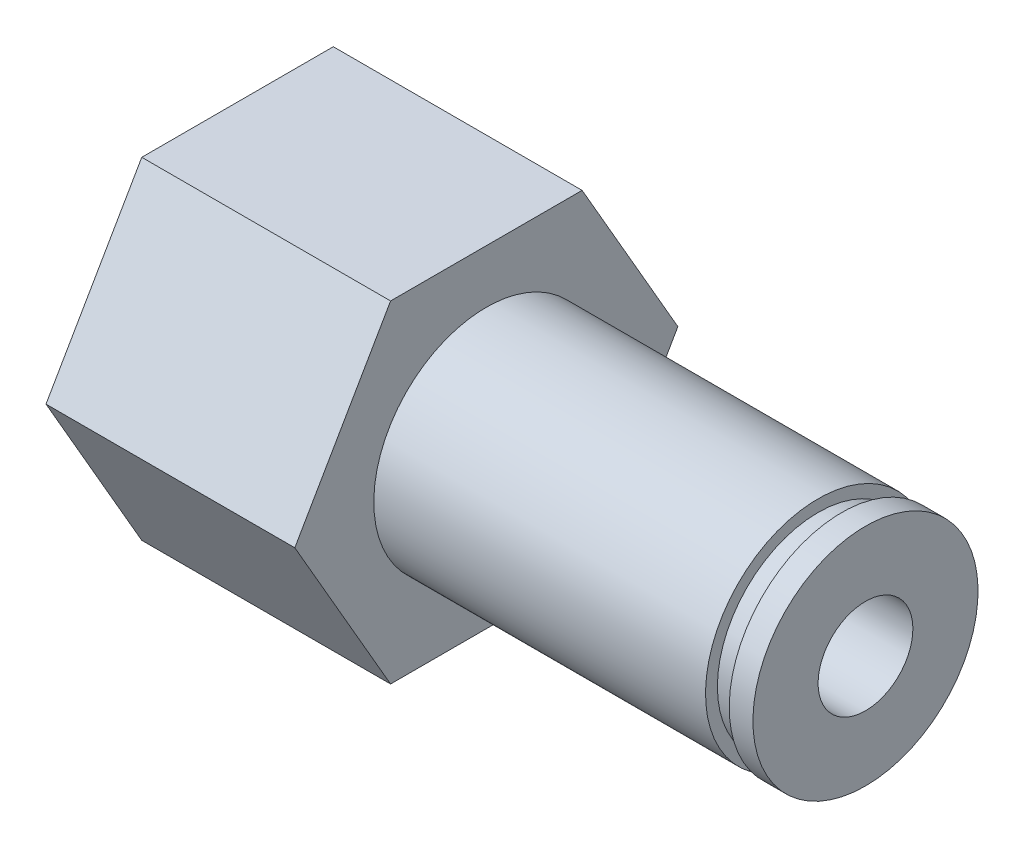
ISO-10303-21;
HEADER;
FILE_DESCRIPTION(('STEP AP214'),'2;1');
FILE_NAME('part.step','',(''),(''),'','','');
FILE_SCHEMA(('AUTOMOTIVE_DESIGN { 1 0 10303 214 1 1 1 1 }'));
ENDSEC;
DATA;
#1=APPLICATION_CONTEXT('core data for automotive mechanical design processes');
#2=APPLICATION_PROTOCOL_DEFINITION('international standard','automotive_design',2000,#1);
#3=PRODUCT_CONTEXT('',#1,'mechanical');
#4=PRODUCT('Part','Part','',(#3));
#5=PRODUCT_RELATED_PRODUCT_CATEGORY('part','',(#4));
#6=PRODUCT_DEFINITION_FORMATION('','',#4);
#7=PRODUCT_DEFINITION_CONTEXT('part definition',#1,'design');
#8=PRODUCT_DEFINITION('design','',#6,#7);
#9=PRODUCT_DEFINITION_SHAPE('','',#8);
#10=(LENGTH_UNIT() NAMED_UNIT(*) SI_UNIT(.MILLI.,.METRE.));
#11=(NAMED_UNIT(*) PLANE_ANGLE_UNIT() SI_UNIT($,.RADIAN.));
#12=(NAMED_UNIT(*) SI_UNIT($,.STERADIAN.) SOLID_ANGLE_UNIT());
#13=UNCERTAINTY_MEASURE_WITH_UNIT(LENGTH_MEASURE(1.E-05),#10,'distance_accuracy_value','');
#14=(GEOMETRIC_REPRESENTATION_CONTEXT(3) GLOBAL_UNCERTAINTY_ASSIGNED_CONTEXT((#13)) GLOBAL_UNIT_ASSIGNED_CONTEXT((#10,
#11,#12)) REPRESENTATION_CONTEXT('',''));
#15=CARTESIAN_POINT('',(0.,0.,0.));
#16=DIRECTION('',(0.,0.,1.));
#17=DIRECTION('',(1.,0.,0.));
#18=AXIS2_PLACEMENT_3D('',#15,#16,#17);
#19=CARTESIAN_POINT('',(0.,4.86,0.));
#20=DIRECTION('',(1.,0.,0.));
#21=DIRECTION('',(0.,1.,0.));
#22=AXIS2_PLACEMENT_3D('',#19,#20,#21);
#23=PLANE('',#22);
#24=DIRECTION('',(0.,0.866025403784439,-0.5));
#25=VECTOR('',#24,1.);
#26=CARTESIAN_POINT('',(0.,-7.,-4.04145188432738));
#27=LINE('',#26,#25);
#28=CARTESIAN_POINT('',(0.,-7.,-4.04145188432738));
#29=VERTEX_POINT('',#28);
#30=CARTESIAN_POINT('',(0.,0.,-8.08290376865476));
#31=VERTEX_POINT('',#30);
#32=EDGE_CURVE('E196',#29,#31,#27,.T.);
#33=ORIENTED_EDGE('',*,*,#32,.F.);
#34=DIRECTION('',(0.,0.,-1.));
#35=VECTOR('',#34,1.);
#36=CARTESIAN_POINT('',(0.,-7.,4.04145188432738));
#37=LINE('',#36,#35);
#38=CARTESIAN_POINT('',(0.,-7.,4.04145188432738));
#39=VERTEX_POINT('',#38);
#40=EDGE_CURVE('E198',#39,#29,#37,.T.);
#41=ORIENTED_EDGE('',*,*,#40,.F.);
#42=DIRECTION('',(0.,-0.866025403784439,-0.5));
#43=VECTOR('',#42,1.);
#44=CARTESIAN_POINT('',(0.,0.,8.08290376865476));
#45=LINE('',#44,#43);
#46=CARTESIAN_POINT('',(0.,0.,8.08290376865476));
#47=VERTEX_POINT('',#46);
#48=EDGE_CURVE('E213',#47,#39,#45,.T.);
#49=ORIENTED_EDGE('',*,*,#48,.F.);
#50=DIRECTION('',(0.,-0.866025403784439,0.5));
#51=VECTOR('',#50,1.);
#52=CARTESIAN_POINT('',(0.,7.,4.04145188432738));
#53=LINE('',#52,#51);
#54=CARTESIAN_POINT('',(0.,7.,4.04145188432738));
#55=VERTEX_POINT('',#54);
#56=EDGE_CURVE('E29',#55,#47,#53,.T.);
#57=ORIENTED_EDGE('',*,*,#56,.F.);
#58=DIRECTION('',(0.,0.,1.));
#59=VECTOR('',#58,1.);
#60=CARTESIAN_POINT('',(0.,7.,-4.04145188432738));
#61=LINE('',#60,#59);
#62=CARTESIAN_POINT('',(0.,7.,-4.04145188432738));
#63=VERTEX_POINT('',#62);
#64=EDGE_CURVE('E205',#63,#55,#61,.T.);
#65=ORIENTED_EDGE('',*,*,#64,.F.);
#66=DIRECTION('',(0.,0.866025403784439,0.5));
#67=VECTOR('',#66,1.);
#68=CARTESIAN_POINT('',(0.,0.,-8.08290376865476));
#69=LINE('',#68,#67);
#70=EDGE_CURVE('E201',#31,#63,#69,.T.);
#71=ORIENTED_EDGE('',*,*,#70,.F.);
#72=EDGE_LOOP('',(#33,#41,#49,#57,#65,#71));
#73=FACE_BOUND('',#72,.T.);
#74=CARTESIAN_POINT('',(0.,0.,0.));
#75=DIRECTION('',(-1.,0.,0.));
#76=DIRECTION('',(0.,-1.,0.));
#77=AXIS2_PLACEMENT_3D('',#74,#75,#76);
#78=CIRCLE('',#77,4.86);
#79=CARTESIAN_POINT('',(0.,-4.86,0.));
#80=VERTEX_POINT('',#79);
#81=EDGE_CURVE('E90',#80,#80,#78,.T.);
#82=ORIENTED_EDGE('',*,*,#81,.F.);
#83=EDGE_LOOP('',(#82));
#84=FACE_BOUND('',#83,.T.);
#85=ADVANCED_FACE('F15',(#73,#84),#23,.F.);
#86=CARTESIAN_POINT('',(10.5,9.,0.));
#87=DIRECTION('',(-1.,0.,0.));
#88=DIRECTION('',(0.,-1.,0.));
#89=AXIS2_PLACEMENT_3D('',#86,#87,#88);
#90=PLANE('',#89);
#91=DIRECTION('',(0.,0.866025403784439,0.5));
#92=VECTOR('',#91,1.);
#93=CARTESIAN_POINT('',(10.5,0.,8.08290376865476));
#94=LINE('',#93,#92);
#95=CARTESIAN_POINT('',(10.5,-7.,4.04145188432738));
#96=VERTEX_POINT('',#95);
#97=CARTESIAN_POINT('',(10.5,0.,8.08290376865476));
#98=VERTEX_POINT('',#97);
#99=EDGE_CURVE('E66',#96,#98,#94,.T.);
#100=ORIENTED_EDGE('',*,*,#99,.F.);
#101=DIRECTION('',(0.,0.,1.));
#102=VECTOR('',#101,1.);
#103=CARTESIAN_POINT('',(10.5,-7.,4.04145188432738));
#104=LINE('',#103,#102);
#105=CARTESIAN_POINT('',(10.5,-7.,-4.04145188432738));
#106=VERTEX_POINT('',#105);
#107=EDGE_CURVE('E74',#106,#96,#104,.T.);
#108=ORIENTED_EDGE('',*,*,#107,.F.);
#109=DIRECTION('',(0.,-0.866025403784439,0.5));
#110=VECTOR('',#109,1.);
#111=CARTESIAN_POINT('',(10.5,-7.,-4.04145188432738));
#112=LINE('',#111,#110);
#113=CARTESIAN_POINT('',(10.5,0.,-8.08290376865476));
#114=VERTEX_POINT('',#113);
#115=EDGE_CURVE('E94',#114,#106,#112,.T.);
#116=ORIENTED_EDGE('',*,*,#115,.F.);
#117=DIRECTION('',(0.,-0.866025403784439,-0.5));
#118=VECTOR('',#117,1.);
#119=CARTESIAN_POINT('',(10.5,0.,-8.08290376865476));
#120=LINE('',#119,#118);
#121=CARTESIAN_POINT('',(10.5,7.,-4.04145188432738));
#122=VERTEX_POINT('',#121);
#123=EDGE_CURVE('E86',#122,#114,#120,.T.);
#124=ORIENTED_EDGE('',*,*,#123,.F.);
#125=DIRECTION('',(0.,0.,-1.));
#126=VECTOR('',#125,1.);
#127=CARTESIAN_POINT('',(10.5,7.,-4.04145188432738));
#128=LINE('',#127,#126);
#129=CARTESIAN_POINT('',(10.5,7.,4.04145188432738));
#130=VERTEX_POINT('',#129);
#131=EDGE_CURVE('E84',#130,#122,#128,.T.);
#132=ORIENTED_EDGE('',*,*,#131,.F.);
#133=DIRECTION('',(0.,0.866025403784439,-0.5));
#134=VECTOR('',#133,1.);
#135=CARTESIAN_POINT('',(10.5,7.,4.04145188432738));
#136=LINE('',#135,#134);
#137=EDGE_CURVE('E73',#98,#130,#136,.T.);
#138=ORIENTED_EDGE('',*,*,#137,.F.);
#139=EDGE_LOOP('',(#100,#108,#116,#124,#132,#138));
#140=FACE_BOUND('',#139,.T.);
#141=CARTESIAN_POINT('',(10.5,0.,0.));
#142=DIRECTION('',(-1.,0.,0.));
#143=DIRECTION('',(0.,-1.,0.));
#144=AXIS2_PLACEMENT_3D('',#141,#142,#143);
#145=CIRCLE('',#144,4.75);
#146=CARTESIAN_POINT('',(10.5,-4.75,0.));
#147=VERTEX_POINT('',#146);
#148=EDGE_CURVE('E9',#147,#147,#145,.T.);
#149=ORIENTED_EDGE('',*,*,#148,.T.);
#150=EDGE_LOOP('',(#149));
#151=FACE_BOUND('',#150,.T.);
#152=ADVANCED_FACE('F81',(#140,#151),#90,.F.);
#153=CARTESIAN_POINT('',(-53.5591054313099,0.,0.));
#154=DIRECTION('',(-1.,0.,0.));
#155=DIRECTION('',(0.,-1.,0.));
#156=AXIS2_PLACEMENT_3D('',#153,#154,#155);
#157=CYLINDRICAL_SURFACE('',#156,4.75);
#158=ORIENTED_EDGE('',*,*,#148,.F.);
#159=EDGE_LOOP('',(#158));
#160=FACE_BOUND('',#159,.T.);
#161=CARTESIAN_POINT('',(24.5,0.,0.));
#162=DIRECTION('',(-1.,0.,0.));
#163=DIRECTION('',(0.,-1.,0.));
#164=AXIS2_PLACEMENT_3D('',#161,#162,#163);
#165=CIRCLE('',#164,4.75);
#166=CARTESIAN_POINT('',(24.5,-4.75,0.));
#167=VERTEX_POINT('',#166);
#168=EDGE_CURVE('E22',#167,#167,#165,.T.);
#169=ORIENTED_EDGE('',*,*,#168,.T.);
#170=EDGE_LOOP('',(#169));
#171=FACE_BOUND('',#170,.T.);
#172=ADVANCED_FACE('F123',(#160,#171),#157,.T.);
#173=CARTESIAN_POINT('',(24.5,4.75,0.));
#174=DIRECTION('',(-1.,0.,0.));
#175=DIRECTION('',(0.,-1.,0.));
#176=AXIS2_PLACEMENT_3D('',#173,#174,#175);
#177=PLANE('',#176);
#178=ORIENTED_EDGE('',*,*,#168,.F.);
#179=EDGE_LOOP('',(#178));
#180=FACE_BOUND('',#179,.T.);
#181=CARTESIAN_POINT('',(24.5,0.,0.));
#182=DIRECTION('',(-1.,0.,0.));
#183=DIRECTION('',(0.,-1.,0.));
#184=AXIS2_PLACEMENT_3D('',#181,#182,#183);
#185=CIRCLE('',#184,4.25);
#186=CARTESIAN_POINT('',(24.5,-4.25,0.));
#187=VERTEX_POINT('',#186);
#188=EDGE_CURVE('E118',#187,#187,#185,.T.);
#189=ORIENTED_EDGE('',*,*,#188,.T.);
#190=EDGE_LOOP('',(#189));
#191=FACE_BOUND('',#190,.T.);
#192=ADVANCED_FACE('F125',(#180,#191),#177,.F.);
#193=CARTESIAN_POINT('',(-53.5591054313099,0.,0.));
#194=DIRECTION('',(-1.,0.,0.));
#195=DIRECTION('',(0.,-1.,0.));
#196=AXIS2_PLACEMENT_3D('',#193,#194,#195);
#197=CYLINDRICAL_SURFACE('',#196,4.25);
#198=ORIENTED_EDGE('',*,*,#188,.F.);
#199=EDGE_LOOP('',(#198));
#200=FACE_BOUND('',#199,.T.);
#201=CARTESIAN_POINT('',(25.5,0.,0.));
#202=DIRECTION('',(-1.,0.,0.));
#203=DIRECTION('',(0.,-1.,0.));
#204=AXIS2_PLACEMENT_3D('',#201,#202,#203);
#205=CIRCLE('',#204,4.25);
#206=CARTESIAN_POINT('',(25.5,-4.25,0.));
#207=VERTEX_POINT('',#206);
#208=EDGE_CURVE('E115',#207,#207,#205,.T.);
#209=ORIENTED_EDGE('',*,*,#208,.T.);
#210=EDGE_LOOP('',(#209));
#211=FACE_BOUND('',#210,.T.);
#212=ADVANCED_FACE('F128',(#200,#211),#197,.T.);
#213=CARTESIAN_POINT('',(25.5,4.25,0.));
#214=DIRECTION('',(1.,0.,0.));
#215=DIRECTION('',(0.,1.,0.));
#216=AXIS2_PLACEMENT_3D('',#213,#214,#215);
#217=PLANE('',#216);
#218=ORIENTED_EDGE('',*,*,#208,.F.);
#219=EDGE_LOOP('',(#218));
#220=FACE_BOUND('',#219,.T.);
#221=CARTESIAN_POINT('',(25.5,0.,0.));
#222=DIRECTION('',(-1.,0.,0.));
#223=DIRECTION('',(0.,-1.,0.));
#224=AXIS2_PLACEMENT_3D('',#221,#222,#223);
#225=CIRCLE('',#224,4.74999999999999);
#226=CARTESIAN_POINT('',(25.5,-4.74999999999999,0.));
#227=VERTEX_POINT('',#226);
#228=EDGE_CURVE('E112',#227,#227,#225,.T.);
#229=ORIENTED_EDGE('',*,*,#228,.T.);
#230=EDGE_LOOP('',(#229));
#231=FACE_BOUND('',#230,.T.);
#232=ADVANCED_FACE('F134',(#220,#231),#217,.F.);
#233=CARTESIAN_POINT('',(-53.5591054313099,0.,0.));
#234=DIRECTION('',(-1.,0.,0.));
#235=DIRECTION('',(0.,-1.,0.));
#236=AXIS2_PLACEMENT_3D('',#233,#234,#235);
#237=CYLINDRICAL_SURFACE('',#236,4.75);
#238=ORIENTED_EDGE('',*,*,#228,.F.);
#239=EDGE_LOOP('',(#238));
#240=FACE_BOUND('',#239,.T.);
#241=CARTESIAN_POINT('',(26.5,0.,0.));
#242=DIRECTION('',(-1.,0.,0.));
#243=DIRECTION('',(0.,-1.,0.));
#244=AXIS2_PLACEMENT_3D('',#241,#242,#243);
#245=CIRCLE('',#244,4.75);
#246=CARTESIAN_POINT('',(26.5,-4.75,0.));
#247=VERTEX_POINT('',#246);
#248=EDGE_CURVE('E109',#247,#247,#245,.T.);
#249=ORIENTED_EDGE('',*,*,#248,.T.);
#250=EDGE_LOOP('',(#249));
#251=FACE_BOUND('',#250,.T.);
#252=ADVANCED_FACE('F140',(#240,#251),#237,.T.);
#253=CARTESIAN_POINT('',(26.5,4.75,0.));
#254=DIRECTION('',(-1.,0.,0.));
#255=DIRECTION('',(0.,-1.,0.));
#256=AXIS2_PLACEMENT_3D('',#253,#254,#255);
#257=PLANE('',#256);
#258=ORIENTED_EDGE('',*,*,#248,.F.);
#259=EDGE_LOOP('',(#258));
#260=FACE_BOUND('',#259,.T.);
#261=CARTESIAN_POINT('',(26.5,0.,0.));
#262=DIRECTION('',(-1.,0.,0.));
#263=DIRECTION('',(0.,-1.,0.));
#264=AXIS2_PLACEMENT_3D('',#261,#262,#263);
#265=CIRCLE('',#264,2.);
#266=CARTESIAN_POINT('',(26.5,-2.,0.));
#267=VERTEX_POINT('',#266);
#268=EDGE_CURVE('E106',#267,#267,#265,.T.);
#269=ORIENTED_EDGE('',*,*,#268,.T.);
#270=EDGE_LOOP('',(#269));
#271=FACE_BOUND('',#270,.T.);
#272=ADVANCED_FACE('F146',(#260,#271),#257,.F.);
#273=CARTESIAN_POINT('',(-53.5591054313099,0.,0.));
#274=DIRECTION('',(-1.,0.,0.));
#275=DIRECTION('',(0.,-1.,0.));
#276=AXIS2_PLACEMENT_3D('',#273,#274,#275);
#277=CYLINDRICAL_SURFACE('',#276,2.);
#278=ORIENTED_EDGE('',*,*,#268,.F.);
#279=EDGE_LOOP('',(#278));
#280=FACE_BOUND('',#279,.T.);
#281=CARTESIAN_POINT('',(10.5,0.,0.));
#282=DIRECTION('',(-1.,0.,0.));
#283=DIRECTION('',(0.,-1.,0.));
#284=AXIS2_PLACEMENT_3D('',#281,#282,#283);
#285=CIRCLE('',#284,2.);
#286=CARTESIAN_POINT('',(10.5,-2.,0.));
#287=VERTEX_POINT('',#286);
#288=EDGE_CURVE('E103',#287,#287,#285,.T.);
#289=ORIENTED_EDGE('',*,*,#288,.T.);
#290=EDGE_LOOP('',(#289));
#291=FACE_BOUND('',#290,.T.);
#292=ADVANCED_FACE('F152',(#280,#291),#277,.F.);
#293=CARTESIAN_POINT('',(10.5,2.,0.));
#294=DIRECTION('',(-1.,0.,0.));
#295=DIRECTION('',(0.,-1.,0.));
#296=AXIS2_PLACEMENT_3D('',#293,#294,#295);
#297=PLANE('',#296);
#298=ORIENTED_EDGE('',*,*,#288,.F.);
#299=EDGE_LOOP('',(#298));
#300=FACE_BOUND('',#299,.T.);
#301=CARTESIAN_POINT('',(10.5,0.,0.));
#302=DIRECTION('',(-1.,0.,0.));
#303=DIRECTION('',(0.,-1.,0.));
#304=AXIS2_PLACEMENT_3D('',#301,#302,#303);
#305=CIRCLE('',#304,0.249999999999999);
#306=CARTESIAN_POINT('',(10.5,-0.249999999999999,0.));
#307=VERTEX_POINT('',#306);
#308=EDGE_CURVE('E100',#307,#307,#305,.T.);
#309=ORIENTED_EDGE('',*,*,#308,.T.);
#310=EDGE_LOOP('',(#309));
#311=FACE_BOUND('',#310,.T.);
#312=ADVANCED_FACE('F158',(#300,#311),#297,.F.);
#313=CARTESIAN_POINT('',(-53.5591054313099,0.,0.));
#314=DIRECTION('',(-1.,0.,0.));
#315=DIRECTION('',(0.,-1.,0.));
#316=AXIS2_PLACEMENT_3D('',#313,#314,#315);
#317=CYLINDRICAL_SURFACE('',#316,0.249999999999999);
#318=ORIENTED_EDGE('',*,*,#308,.F.);
#319=EDGE_LOOP('',(#318));
#320=FACE_BOUND('',#319,.T.);
#321=CARTESIAN_POINT('',(9.00000000000001,0.,0.));
#322=DIRECTION('',(-1.,0.,0.));
#323=DIRECTION('',(0.,-1.,0.));
#324=AXIS2_PLACEMENT_3D('',#321,#322,#323);
#325=CIRCLE('',#324,0.249999999999999);
#326=CARTESIAN_POINT('',(9.00000000000001,-0.249999999999999,0.));
#327=VERTEX_POINT('',#326);
#328=EDGE_CURVE('E97',#327,#327,#325,.T.);
#329=ORIENTED_EDGE('',*,*,#328,.T.);
#330=EDGE_LOOP('',(#329));
#331=FACE_BOUND('',#330,.T.);
#332=ADVANCED_FACE('F164',(#320,#331),#317,.F.);
#333=CARTESIAN_POINT('',(9.,4.86,0.));
#334=DIRECTION('',(1.,0.,0.));
#335=DIRECTION('',(0.,1.,0.));
#336=AXIS2_PLACEMENT_3D('',#333,#334,#335);
#337=PLANE('',#336);
#338=ORIENTED_EDGE('',*,*,#328,.F.);
#339=EDGE_LOOP('',(#338));
#340=FACE_BOUND('',#339,.T.);
#341=CARTESIAN_POINT('',(9.00000000000001,0.,0.));
#342=DIRECTION('',(-1.,0.,0.));
#343=DIRECTION('',(0.,-1.,0.));
#344=AXIS2_PLACEMENT_3D('',#341,#342,#343);
#345=CIRCLE('',#344,4.86);
#346=CARTESIAN_POINT('',(9.00000000000001,-4.86,0.));
#347=VERTEX_POINT('',#346);
#348=EDGE_CURVE('E93',#347,#347,#345,.T.);
#349=ORIENTED_EDGE('',*,*,#348,.T.);
#350=EDGE_LOOP('',(#349));
#351=FACE_BOUND('',#350,.T.);
#352=ADVANCED_FACE('F170',(#340,#351),#337,.F.);
#353=CARTESIAN_POINT('',(-53.5591054313099,0.,0.));
#354=DIRECTION('',(-1.,0.,0.));
#355=DIRECTION('',(0.,-1.,0.));
#356=AXIS2_PLACEMENT_3D('',#353,#354,#355);
#357=CYLINDRICAL_SURFACE('',#356,4.86);
#358=ORIENTED_EDGE('',*,*,#348,.F.);
#359=EDGE_LOOP('',(#358));
#360=FACE_BOUND('',#359,.T.);
#361=ORIENTED_EDGE('',*,*,#81,.T.);
#362=EDGE_LOOP('',(#361));
#363=FACE_BOUND('',#362,.T.);
#364=ADVANCED_FACE('F176',(#360,#363),#357,.F.);
#365=CARTESIAN_POINT('',(36.2104025639429,-7.,4.04145188432738));
#366=DIRECTION('',(0.,1.,0.));
#367=DIRECTION('',(0.,0.,1.));
#368=AXIS2_PLACEMENT_3D('',#365,#366,#367);
#369=PLANE('',#368);
#370=ORIENTED_EDGE('',*,*,#107,.T.);
#371=DIRECTION('',(-1.,0.,0.));
#372=VECTOR('',#371,1.);
#373=CARTESIAN_POINT('',(36.2104025639429,-7.,4.04145188432738));
#374=LINE('',#373,#372);
#375=EDGE_CURVE('E37',#96,#39,#374,.T.);
#376=ORIENTED_EDGE('',*,*,#375,.T.);
#377=ORIENTED_EDGE('',*,*,#40,.T.);
#378=DIRECTION('',(-1.,0.,0.));
#379=VECTOR('',#378,1.);
#380=CARTESIAN_POINT('',(36.2104025639429,-7.,-4.04145188432738));
#381=LINE('',#380,#379);
#382=EDGE_CURVE('E210',#106,#29,#381,.T.);
#383=ORIENTED_EDGE('',*,*,#382,.F.);
#384=EDGE_LOOP('',(#370,#376,#377,#383));
#385=FACE_BOUND('',#384,.T.);
#386=ADVANCED_FACE('F182',(#385),#369,.F.);
#387=CARTESIAN_POINT('',(36.2104025639429,-7.,-4.04145188432738));
#388=DIRECTION('',(0.,0.5,0.866025403784439));
#389=DIRECTION('',(0.,-0.866025403784439,0.5));
#390=AXIS2_PLACEMENT_3D('',#387,#388,#389);
#391=PLANE('',#390);
#392=ORIENTED_EDGE('',*,*,#115,.T.);
#393=ORIENTED_EDGE('',*,*,#382,.T.);
#394=ORIENTED_EDGE('',*,*,#32,.T.);
#395=DIRECTION('',(-1.,0.,0.));
#396=VECTOR('',#395,1.);
#397=CARTESIAN_POINT('',(36.2104025639429,0.,-8.08290376865476));
#398=LINE('',#397,#396);
#399=EDGE_CURVE('E212',#114,#31,#398,.T.);
#400=ORIENTED_EDGE('',*,*,#399,.F.);
#401=EDGE_LOOP('',(#392,#393,#394,#400));
#402=FACE_BOUND('',#401,.T.);
#403=ADVANCED_FACE('F224',(#402),#391,.F.);
#404=CARTESIAN_POINT('',(36.2104025639429,0.,-8.08290376865476));
#405=DIRECTION('',(0.,-0.5,0.866025403784439));
#406=DIRECTION('',(0.,-0.866025403784439,-0.5));
#407=AXIS2_PLACEMENT_3D('',#404,#405,#406);
#408=PLANE('',#407);
#409=ORIENTED_EDGE('',*,*,#123,.T.);
#410=ORIENTED_EDGE('',*,*,#399,.T.);
#411=ORIENTED_EDGE('',*,*,#70,.T.);
#412=DIRECTION('',(-1.,0.,0.));
#413=VECTOR('',#412,1.);
#414=CARTESIAN_POINT('',(36.2104025639429,7.,-4.04145188432738));
#415=LINE('',#414,#413);
#416=EDGE_CURVE('E215',#122,#63,#415,.T.);
#417=ORIENTED_EDGE('',*,*,#416,.F.);
#418=EDGE_LOOP('',(#409,#410,#411,#417));
#419=FACE_BOUND('',#418,.T.);
#420=ADVANCED_FACE('F222',(#419),#408,.F.);
#421=CARTESIAN_POINT('',(36.2104025639429,7.,-4.04145188432738));
#422=DIRECTION('',(0.,-1.,0.));
#423=DIRECTION('',(0.,0.,-1.));
#424=AXIS2_PLACEMENT_3D('',#421,#422,#423);
#425=PLANE('',#424);
#426=ORIENTED_EDGE('',*,*,#131,.T.);
#427=ORIENTED_EDGE('',*,*,#416,.T.);
#428=ORIENTED_EDGE('',*,*,#64,.T.);
#429=DIRECTION('',(-1.,0.,0.));
#430=VECTOR('',#429,1.);
#431=CARTESIAN_POINT('',(36.2104025639429,7.,4.04145188432738));
#432=LINE('',#431,#430);
#433=EDGE_CURVE('E78',#130,#55,#432,.T.);
#434=ORIENTED_EDGE('',*,*,#433,.F.);
#435=EDGE_LOOP('',(#426,#427,#428,#434));
#436=FACE_BOUND('',#435,.T.);
#437=ADVANCED_FACE('F231',(#436),#425,.F.);
#438=CARTESIAN_POINT('',(36.2104025639429,7.,4.04145188432738));
#439=DIRECTION('',(0.,-0.5,-0.866025403784439));
#440=DIRECTION('',(0.,0.866025403784439,-0.5));
#441=AXIS2_PLACEMENT_3D('',#438,#439,#440);
#442=PLANE('',#441);
#443=ORIENTED_EDGE('',*,*,#137,.T.);
#444=ORIENTED_EDGE('',*,*,#433,.T.);
#445=ORIENTED_EDGE('',*,*,#56,.T.);
#446=DIRECTION('',(-1.,0.,0.));
#447=VECTOR('',#446,1.);
#448=CARTESIAN_POINT('',(36.2104025639429,0.,8.08290376865476));
#449=LINE('',#448,#447);
#450=EDGE_CURVE('E68',#98,#47,#449,.T.);
#451=ORIENTED_EDGE('',*,*,#450,.F.);
#452=EDGE_LOOP('',(#443,#444,#445,#451));
#453=FACE_BOUND('',#452,.T.);
#454=ADVANCED_FACE('F76',(#453),#442,.F.);
#455=CARTESIAN_POINT('',(36.2104025639429,0.,8.08290376865476));
#456=DIRECTION('',(0.,0.5,-0.866025403784439));
#457=DIRECTION('',(0.,0.866025403784439,0.5));
#458=AXIS2_PLACEMENT_3D('',#455,#456,#457);
#459=PLANE('',#458);
#460=ORIENTED_EDGE('',*,*,#99,.T.);
#461=ORIENTED_EDGE('',*,*,#450,.T.);
#462=ORIENTED_EDGE('',*,*,#48,.T.);
#463=ORIENTED_EDGE('',*,*,#375,.F.);
#464=EDGE_LOOP('',(#460,#461,#462,#463));
#465=FACE_BOUND('',#464,.T.);
#466=ADVANCED_FACE('F67',(#465),#459,.F.);
#467=CLOSED_SHELL('',(#85,#152,#172,#192,#212,#232,#252,#272,#292,#312,#332,#352,#364,#386,#403,
#420,#437,#454,#466));
#468=MANIFOLD_SOLID_BREP('B1',#467);
#469=ADVANCED_BREP_SHAPE_REPRESENTATION('',(#18,#468),#14);
#470=SHAPE_DEFINITION_REPRESENTATION(#9,#469);
ENDSEC;
END-ISO-10303-21;
